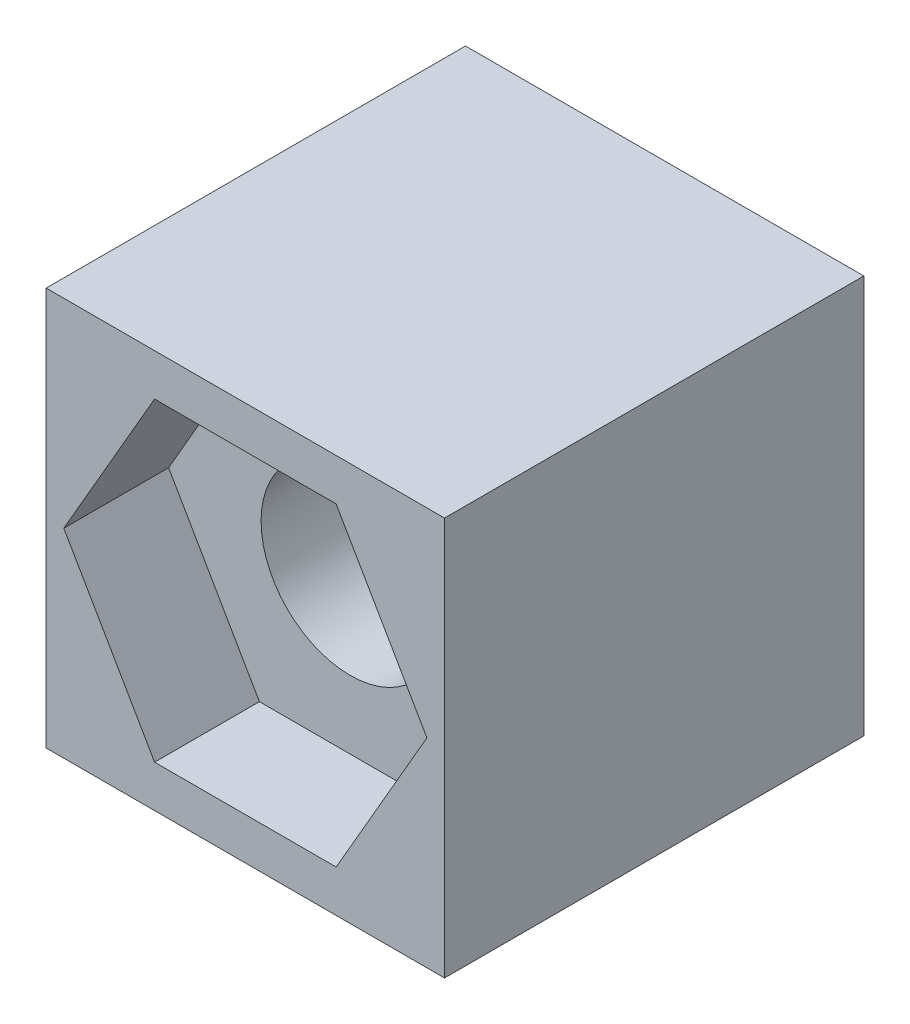
ISO-10303-21;
HEADER;
FILE_DESCRIPTION(('STEP AP214'),'2;1');
FILE_NAME('part.step','',(''),(''),'','','');
FILE_SCHEMA(('AUTOMOTIVE_DESIGN { 1 0 10303 214 1 1 1 1 }'));
ENDSEC;
DATA;
#1=APPLICATION_CONTEXT('core data for automotive mechanical design processes');
#2=APPLICATION_PROTOCOL_DEFINITION('international standard','automotive_design',2000,#1);
#3=PRODUCT_CONTEXT('',#1,'mechanical');
#4=PRODUCT('Part','Part','',(#3));
#5=PRODUCT_RELATED_PRODUCT_CATEGORY('part','',(#4));
#6=PRODUCT_DEFINITION_FORMATION('','',#4);
#7=PRODUCT_DEFINITION_CONTEXT('part definition',#1,'design');
#8=PRODUCT_DEFINITION('design','',#6,#7);
#9=PRODUCT_DEFINITION_SHAPE('','',#8);
#10=(LENGTH_UNIT() NAMED_UNIT(*) SI_UNIT(.MILLI.,.METRE.));
#11=(NAMED_UNIT(*) PLANE_ANGLE_UNIT() SI_UNIT($,.RADIAN.));
#12=(NAMED_UNIT(*) SI_UNIT($,.STERADIAN.) SOLID_ANGLE_UNIT());
#13=UNCERTAINTY_MEASURE_WITH_UNIT(LENGTH_MEASURE(1.E-05),#10,'distance_accuracy_value','');
#14=(GEOMETRIC_REPRESENTATION_CONTEXT(3) GLOBAL_UNCERTAINTY_ASSIGNED_CONTEXT((#13)) GLOBAL_UNIT_ASSIGNED_CONTEXT((#10,
#11,#12)) REPRESENTATION_CONTEXT('',''));
#15=CARTESIAN_POINT('',(0.,0.,0.));
#16=DIRECTION('',(0.,0.,1.));
#17=DIRECTION('',(1.,0.,0.));
#18=AXIS2_PLACEMENT_3D('',#15,#16,#17);
#19=CARTESIAN_POINT('',(3.8,3.8,8.));
#20=DIRECTION('',(0.,0.,-1.));
#21=DIRECTION('',(-1.,0.,0.));
#22=AXIS2_PLACEMENT_3D('',#19,#20,#21);
#23=CYLINDRICAL_SURFACE('',#22,1.7);
#24=CARTESIAN_POINT('',(3.8,3.8,0.));
#25=DIRECTION('',(0.,0.,1.));
#26=DIRECTION('',(1.,0.,0.));
#27=AXIS2_PLACEMENT_3D('',#24,#25,#26);
#28=CIRCLE('',#27,1.7);
#29=CARTESIAN_POINT('',(5.5,3.8,0.));
#30=VERTEX_POINT('',#29);
#31=EDGE_CURVE('E199',#30,#30,#28,.T.);
#32=ORIENTED_EDGE('',*,*,#31,.F.);
#33=EDGE_LOOP('',(#32));
#34=FACE_BOUND('',#33,.T.);
#35=CARTESIAN_POINT('',(3.8,3.8,6.));
#36=DIRECTION('',(0.,0.,1.));
#37=DIRECTION('',(1.,0.,0.));
#38=AXIS2_PLACEMENT_3D('',#35,#36,#37);
#39=CIRCLE('',#38,1.7);
#40=CARTESIAN_POINT('',(5.5,3.8,6.));
#41=VERTEX_POINT('',#40);
#42=EDGE_CURVE('E43',#41,#41,#39,.T.);
#43=ORIENTED_EDGE('',*,*,#42,.T.);
#44=EDGE_LOOP('',(#43));
#45=FACE_BOUND('',#44,.T.);
#46=ADVANCED_FACE('F39',(#34,#45),#23,.F.);
#47=CARTESIAN_POINT('',(0.,0.,8.));
#48=DIRECTION('',(0.,0.,-1.));
#49=DIRECTION('',(-1.,0.,0.));
#50=AXIS2_PLACEMENT_3D('',#47,#48,#49);
#51=PLANE('',#50);
#52=DIRECTION('',(0.5,0.866025403784439,0.));
#53=VECTOR('',#52,1.);
#54=CARTESIAN_POINT('',(5.53205080756888,0.800000000000002,8.));
#55=LINE('',#54,#53);
#56=CARTESIAN_POINT('',(5.53205080756888,0.800000000000002,8.));
#57=VERTEX_POINT('',#56);
#58=CARTESIAN_POINT('',(7.26410161513775,3.8,8.));
#59=VERTEX_POINT('',#58);
#60=EDGE_CURVE('E171',#57,#59,#55,.T.);
#61=ORIENTED_EDGE('',*,*,#60,.F.);
#62=DIRECTION('',(1.,0.,0.));
#63=VECTOR('',#62,1.);
#64=CARTESIAN_POINT('',(2.06794919243112,0.800000000000001,8.));
#65=LINE('',#64,#63);
#66=CARTESIAN_POINT('',(2.06794919243112,0.800000000000001,8.));
#67=VERTEX_POINT('',#66);
#68=EDGE_CURVE('E56',#67,#57,#65,.T.);
#69=ORIENTED_EDGE('',*,*,#68,.F.);
#70=DIRECTION('',(0.5,-0.866025403784439,0.));
#71=VECTOR('',#70,1.);
#72=CARTESIAN_POINT('',(0.335898384862246,3.8,8.));
#73=LINE('',#72,#71);
#74=CARTESIAN_POINT('',(0.335898384862246,3.8,8.));
#75=VERTEX_POINT('',#74);
#76=EDGE_CURVE('E151',#75,#67,#73,.T.);
#77=ORIENTED_EDGE('',*,*,#76,.F.);
#78=DIRECTION('',(-0.5,-0.866025403784438,0.));
#79=VECTOR('',#78,1.);
#80=CARTESIAN_POINT('',(2.06794919243112,6.8,8.));
#81=LINE('',#80,#79);
#82=CARTESIAN_POINT('',(2.06794919243112,6.8,8.));
#83=VERTEX_POINT('',#82);
#84=EDGE_CURVE('E155',#83,#75,#81,.T.);
#85=ORIENTED_EDGE('',*,*,#84,.F.);
#86=DIRECTION('',(-1.,0.,0.));
#87=VECTOR('',#86,1.);
#88=CARTESIAN_POINT('',(5.53205080756888,6.8,8.));
#89=LINE('',#88,#87);
#90=CARTESIAN_POINT('',(5.53205080756888,6.8,8.));
#91=VERTEX_POINT('',#90);
#92=EDGE_CURVE('E178',#91,#83,#89,.T.);
#93=ORIENTED_EDGE('',*,*,#92,.F.);
#94=DIRECTION('',(-0.5,0.866025403784439,0.));
#95=VECTOR('',#94,1.);
#96=CARTESIAN_POINT('',(7.26410161513775,3.8,8.));
#97=LINE('',#96,#95);
#98=EDGE_CURVE('E174',#59,#91,#97,.T.);
#99=ORIENTED_EDGE('',*,*,#98,.F.);
#100=EDGE_LOOP('',(#61,#69,#77,#85,#93,#99));
#101=FACE_BOUND('',#100,.T.);
#102=DIRECTION('',(0.,-1.,0.));
#103=VECTOR('',#102,1.);
#104=CARTESIAN_POINT('',(0.,0.,8.));
#105=LINE('',#104,#103);
#106=CARTESIAN_POINT('',(0.,7.6,8.));
#107=VERTEX_POINT('',#106);
#108=CARTESIAN_POINT('',(0.,0.,8.));
#109=VERTEX_POINT('',#108);
#110=EDGE_CURVE('E204',#107,#109,#105,.T.);
#111=ORIENTED_EDGE('',*,*,#110,.T.);
#112=DIRECTION('',(1.,0.,0.));
#113=VECTOR('',#112,1.);
#114=CARTESIAN_POINT('',(0.,0.,8.));
#115=LINE('',#114,#113);
#116=CARTESIAN_POINT('',(7.6,0.,8.));
#117=VERTEX_POINT('',#116);
#118=EDGE_CURVE('E93',#109,#117,#115,.T.);
#119=ORIENTED_EDGE('',*,*,#118,.T.);
#120=DIRECTION('',(0.,1.,0.));
#121=VECTOR('',#120,1.);
#122=CARTESIAN_POINT('',(7.6,0.,8.));
#123=LINE('',#122,#121);
#124=CARTESIAN_POINT('',(7.6,7.6,8.));
#125=VERTEX_POINT('',#124);
#126=EDGE_CURVE('E209',#117,#125,#123,.T.);
#127=ORIENTED_EDGE('',*,*,#126,.T.);
#128=DIRECTION('',(-1.,0.,0.));
#129=VECTOR('',#128,1.);
#130=CARTESIAN_POINT('',(0.,7.6,8.));
#131=LINE('',#130,#129);
#132=EDGE_CURVE('E65',#125,#107,#131,.T.);
#133=ORIENTED_EDGE('',*,*,#132,.T.);
#134=EDGE_LOOP('',(#111,#119,#127,#133));
#135=FACE_BOUND('',#134,.T.);
#136=ADVANCED_FACE('F258',(#101,#135),#51,.F.);
#137=CARTESIAN_POINT('',(0.,0.,0.));
#138=DIRECTION('',(0.,0.,-1.));
#139=DIRECTION('',(-1.,0.,0.));
#140=AXIS2_PLACEMENT_3D('',#137,#138,#139);
#141=PLANE('',#140);
#142=DIRECTION('',(0.,-1.,0.));
#143=VECTOR('',#142,1.);
#144=CARTESIAN_POINT('',(0.,0.,0.));
#145=LINE('',#144,#143);
#146=CARTESIAN_POINT('',(0.,7.6,0.));
#147=VERTEX_POINT('',#146);
#148=CARTESIAN_POINT('',(0.,0.,0.));
#149=VERTEX_POINT('',#148);
#150=EDGE_CURVE('E203',#147,#149,#145,.T.);
#151=ORIENTED_EDGE('',*,*,#150,.F.);
#152=DIRECTION('',(-1.,0.,0.));
#153=VECTOR('',#152,1.);
#154=CARTESIAN_POINT('',(0.,7.6,0.));
#155=LINE('',#154,#153);
#156=CARTESIAN_POINT('',(7.6,7.6,0.));
#157=VERTEX_POINT('',#156);
#158=EDGE_CURVE('E86',#157,#147,#155,.T.);
#159=ORIENTED_EDGE('',*,*,#158,.F.);
#160=DIRECTION('',(0.,1.,0.));
#161=VECTOR('',#160,1.);
#162=CARTESIAN_POINT('',(7.6,0.,0.));
#163=LINE('',#162,#161);
#164=CARTESIAN_POINT('',(7.6,0.,0.));
#165=VERTEX_POINT('',#164);
#166=EDGE_CURVE('E221',#165,#157,#163,.T.);
#167=ORIENTED_EDGE('',*,*,#166,.F.);
#168=DIRECTION('',(1.,0.,0.));
#169=VECTOR('',#168,1.);
#170=CARTESIAN_POINT('',(0.,0.,0.));
#171=LINE('',#170,#169);
#172=EDGE_CURVE('E218',#149,#165,#171,.T.);
#173=ORIENTED_EDGE('',*,*,#172,.F.);
#174=EDGE_LOOP('',(#151,#159,#167,#173));
#175=FACE_BOUND('',#174,.T.);
#176=ORIENTED_EDGE('',*,*,#31,.T.);
#177=EDGE_LOOP('',(#176));
#178=FACE_BOUND('',#177,.T.);
#179=ADVANCED_FACE('F240',(#175,#178),#141,.T.);
#180=CARTESIAN_POINT('',(0.,0.,8.));
#181=DIRECTION('',(1.,0.,0.));
#182=DIRECTION('',(0.,0.,-1.));
#183=AXIS2_PLACEMENT_3D('',#180,#181,#182);
#184=PLANE('',#183);
#185=ORIENTED_EDGE('',*,*,#150,.T.);
#186=DIRECTION('',(0.,0.,-1.));
#187=VECTOR('',#186,1.);
#188=CARTESIAN_POINT('',(0.,0.,8.));
#189=LINE('',#188,#187);
#190=EDGE_CURVE('E11',#109,#149,#189,.T.);
#191=ORIENTED_EDGE('',*,*,#190,.F.);
#192=ORIENTED_EDGE('',*,*,#110,.F.);
#193=DIRECTION('',(0.,0.,-1.));
#194=VECTOR('',#193,1.);
#195=CARTESIAN_POINT('',(0.,7.6,8.));
#196=LINE('',#195,#194);
#197=EDGE_CURVE('E214',#107,#147,#196,.T.);
#198=ORIENTED_EDGE('',*,*,#197,.T.);
#199=EDGE_LOOP('',(#185,#191,#192,#198));
#200=FACE_BOUND('',#199,.T.);
#201=ADVANCED_FACE('F41',(#200),#184,.F.);
#202=CARTESIAN_POINT('',(0.,0.,8.));
#203=DIRECTION('',(0.,1.,0.));
#204=DIRECTION('',(0.,0.,1.));
#205=AXIS2_PLACEMENT_3D('',#202,#203,#204);
#206=PLANE('',#205);
#207=ORIENTED_EDGE('',*,*,#172,.T.);
#208=DIRECTION('',(0.,0.,-1.));
#209=VECTOR('',#208,1.);
#210=CARTESIAN_POINT('',(7.6,0.,8.));
#211=LINE('',#210,#209);
#212=EDGE_CURVE('E49',#117,#165,#211,.T.);
#213=ORIENTED_EDGE('',*,*,#212,.F.);
#214=ORIENTED_EDGE('',*,*,#118,.F.);
#215=ORIENTED_EDGE('',*,*,#190,.T.);
#216=EDGE_LOOP('',(#207,#213,#214,#215));
#217=FACE_BOUND('',#216,.T.);
#218=ADVANCED_FACE('F254',(#217),#206,.F.);
#219=CARTESIAN_POINT('',(7.6,0.,8.));
#220=DIRECTION('',(-1.,0.,0.));
#221=DIRECTION('',(0.,0.,1.));
#222=AXIS2_PLACEMENT_3D('',#219,#220,#221);
#223=PLANE('',#222);
#224=ORIENTED_EDGE('',*,*,#166,.T.);
#225=DIRECTION('',(0.,0.,-1.));
#226=VECTOR('',#225,1.);
#227=CARTESIAN_POINT('',(7.6,7.6,8.));
#228=LINE('',#227,#226);
#229=EDGE_CURVE('E228',#125,#157,#228,.T.);
#230=ORIENTED_EDGE('',*,*,#229,.F.);
#231=ORIENTED_EDGE('',*,*,#126,.F.);
#232=ORIENTED_EDGE('',*,*,#212,.T.);
#233=EDGE_LOOP('',(#224,#230,#231,#232));
#234=FACE_BOUND('',#233,.T.);
#235=ADVANCED_FACE('F236',(#234),#223,.F.);
#236=CARTESIAN_POINT('',(0.,7.6,8.));
#237=DIRECTION('',(0.,-1.,0.));
#238=DIRECTION('',(0.,0.,-1.));
#239=AXIS2_PLACEMENT_3D('',#236,#237,#238);
#240=PLANE('',#239);
#241=ORIENTED_EDGE('',*,*,#158,.T.);
#242=ORIENTED_EDGE('',*,*,#197,.F.);
#243=ORIENTED_EDGE('',*,*,#132,.F.);
#244=ORIENTED_EDGE('',*,*,#229,.T.);
#245=EDGE_LOOP('',(#241,#242,#243,#244));
#246=FACE_BOUND('',#245,.T.);
#247=ADVANCED_FACE('F245',(#246),#240,.F.);
#248=CARTESIAN_POINT('',(2.06794919243112,0.800000000000001,6.));
#249=DIRECTION('',(0.,-1.,0.));
#250=DIRECTION('',(1.,0.,0.));
#251=AXIS2_PLACEMENT_3D('',#248,#249,#250);
#252=PLANE('',#251);
#253=ORIENTED_EDGE('',*,*,#68,.T.);
#254=DIRECTION('',(0.,0.,1.));
#255=VECTOR('',#254,1.);
#256=CARTESIAN_POINT('',(5.53205080756888,0.800000000000002,6.));
#257=LINE('',#256,#255);
#258=CARTESIAN_POINT('',(5.53205080756888,0.800000000000002,6.));
#259=VERTEX_POINT('',#258);
#260=EDGE_CURVE('E125',#259,#57,#257,.T.);
#261=ORIENTED_EDGE('',*,*,#260,.F.);
#262=DIRECTION('',(1.,0.,0.));
#263=VECTOR('',#262,1.);
#264=CARTESIAN_POINT('',(2.06794919243112,0.800000000000001,6.));
#265=LINE('',#264,#263);
#266=CARTESIAN_POINT('',(2.06794919243112,0.800000000000001,6.));
#267=VERTEX_POINT('',#266);
#268=EDGE_CURVE('E129',#267,#259,#265,.T.);
#269=ORIENTED_EDGE('',*,*,#268,.F.);
#270=DIRECTION('',(0.,0.,1.));
#271=VECTOR('',#270,1.);
#272=CARTESIAN_POINT('',(2.06794919243112,0.800000000000001,6.));
#273=LINE('',#272,#271);
#274=EDGE_CURVE('E185',#267,#67,#273,.T.);
#275=ORIENTED_EDGE('',*,*,#274,.T.);
#276=EDGE_LOOP('',(#253,#261,#269,#275));
#277=FACE_BOUND('',#276,.T.);
#278=ADVANCED_FACE('F127',(#277),#252,.F.);
#279=CARTESIAN_POINT('',(0.335898384862246,3.8,6.));
#280=DIRECTION('',(-0.866025403784439,-0.5,0.));
#281=DIRECTION('',(0.5,-0.866025403784439,0.));
#282=AXIS2_PLACEMENT_3D('',#279,#280,#281);
#283=PLANE('',#282);
#284=ORIENTED_EDGE('',*,*,#76,.T.);
#285=ORIENTED_EDGE('',*,*,#274,.F.);
#286=DIRECTION('',(0.5,-0.866025403784439,0.));
#287=VECTOR('',#286,1.);
#288=CARTESIAN_POINT('',(0.335898384862246,3.8,6.));
#289=LINE('',#288,#287);
#290=CARTESIAN_POINT('',(0.335898384862246,3.8,6.));
#291=VERTEX_POINT('',#290);
#292=EDGE_CURVE('E136',#291,#267,#289,.T.);
#293=ORIENTED_EDGE('',*,*,#292,.F.);
#294=DIRECTION('',(0.,0.,1.));
#295=VECTOR('',#294,1.);
#296=CARTESIAN_POINT('',(0.335898384862246,3.8,6.));
#297=LINE('',#296,#295);
#298=EDGE_CURVE('E188',#291,#75,#297,.T.);
#299=ORIENTED_EDGE('',*,*,#298,.T.);
#300=EDGE_LOOP('',(#284,#285,#293,#299));
#301=FACE_BOUND('',#300,.T.);
#302=ADVANCED_FACE('F252',(#301),#283,.F.);
#303=CARTESIAN_POINT('',(2.06794919243112,6.8,6.));
#304=DIRECTION('',(-0.866025403784438,0.5,0.));
#305=DIRECTION('',(-0.5,-0.866025403784438,0.));
#306=AXIS2_PLACEMENT_3D('',#303,#304,#305);
#307=PLANE('',#306);
#308=ORIENTED_EDGE('',*,*,#84,.T.);
#309=ORIENTED_EDGE('',*,*,#298,.F.);
#310=DIRECTION('',(-0.5,-0.866025403784438,0.));
#311=VECTOR('',#310,1.);
#312=CARTESIAN_POINT('',(2.06794919243112,6.8,6.));
#313=LINE('',#312,#311);
#314=CARTESIAN_POINT('',(2.06794919243112,6.8,6.));
#315=VERTEX_POINT('',#314);
#316=EDGE_CURVE('E164',#315,#291,#313,.T.);
#317=ORIENTED_EDGE('',*,*,#316,.F.);
#318=DIRECTION('',(0.,0.,1.));
#319=VECTOR('',#318,1.);
#320=CARTESIAN_POINT('',(2.06794919243112,6.8,6.));
#321=LINE('',#320,#319);
#322=EDGE_CURVE('E191',#315,#83,#321,.T.);
#323=ORIENTED_EDGE('',*,*,#322,.T.);
#324=EDGE_LOOP('',(#308,#309,#317,#323));
#325=FACE_BOUND('',#324,.T.);
#326=ADVANCED_FACE('F312',(#325),#307,.F.);
#327=CARTESIAN_POINT('',(5.53205080756888,6.8,6.));
#328=DIRECTION('',(0.,1.,0.));
#329=DIRECTION('',(0.,0.,1.));
#330=AXIS2_PLACEMENT_3D('',#327,#328,#329);
#331=PLANE('',#330);
#332=ORIENTED_EDGE('',*,*,#92,.T.);
#333=ORIENTED_EDGE('',*,*,#322,.F.);
#334=DIRECTION('',(-1.,0.,0.));
#335=VECTOR('',#334,1.);
#336=CARTESIAN_POINT('',(5.53205080756888,6.8,6.));
#337=LINE('',#336,#335);
#338=CARTESIAN_POINT('',(5.53205080756888,6.8,6.));
#339=VERTEX_POINT('',#338);
#340=EDGE_CURVE('E160',#339,#315,#337,.T.);
#341=ORIENTED_EDGE('',*,*,#340,.F.);
#342=DIRECTION('',(0.,0.,1.));
#343=VECTOR('',#342,1.);
#344=CARTESIAN_POINT('',(5.53205080756888,6.8,6.));
#345=LINE('',#344,#343);
#346=EDGE_CURVE('E194',#339,#91,#345,.T.);
#347=ORIENTED_EDGE('',*,*,#346,.T.);
#348=EDGE_LOOP('',(#332,#333,#341,#347));
#349=FACE_BOUND('',#348,.T.);
#350=ADVANCED_FACE('F322',(#349),#331,.F.);
#351=CARTESIAN_POINT('',(7.26410161513775,3.8,6.));
#352=DIRECTION('',(0.866025403784439,0.5,0.));
#353=DIRECTION('',(-0.5,0.866025403784439,0.));
#354=AXIS2_PLACEMENT_3D('',#351,#352,#353);
#355=PLANE('',#354);
#356=ORIENTED_EDGE('',*,*,#98,.T.);
#357=ORIENTED_EDGE('',*,*,#346,.F.);
#358=DIRECTION('',(-0.5,0.866025403784439,0.));
#359=VECTOR('',#358,1.);
#360=CARTESIAN_POINT('',(7.26410161513775,3.8,6.));
#361=LINE('',#360,#359);
#362=CARTESIAN_POINT('',(7.26410161513775,3.8,6.));
#363=VERTEX_POINT('',#362);
#364=EDGE_CURVE('E145',#363,#339,#361,.T.);
#365=ORIENTED_EDGE('',*,*,#364,.F.);
#366=DIRECTION('',(0.,0.,1.));
#367=VECTOR('',#366,1.);
#368=CARTESIAN_POINT('',(7.26410161513775,3.8,6.));
#369=LINE('',#368,#367);
#370=EDGE_CURVE('E135',#363,#59,#369,.T.);
#371=ORIENTED_EDGE('',*,*,#370,.T.);
#372=EDGE_LOOP('',(#356,#357,#365,#371));
#373=FACE_BOUND('',#372,.T.);
#374=ADVANCED_FACE('F332',(#373),#355,.F.);
#375=CARTESIAN_POINT('',(5.53205080756888,0.800000000000002,6.));
#376=DIRECTION('',(0.866025403784439,-0.5,0.));
#377=DIRECTION('',(0.5,0.866025403784439,0.));
#378=AXIS2_PLACEMENT_3D('',#375,#376,#377);
#379=PLANE('',#378);
#380=ORIENTED_EDGE('',*,*,#60,.T.);
#381=ORIENTED_EDGE('',*,*,#370,.F.);
#382=DIRECTION('',(0.5,0.866025403784439,0.));
#383=VECTOR('',#382,1.);
#384=CARTESIAN_POINT('',(5.53205080756888,0.800000000000002,6.));
#385=LINE('',#384,#383);
#386=EDGE_CURVE('E139',#259,#363,#385,.T.);
#387=ORIENTED_EDGE('',*,*,#386,.F.);
#388=ORIENTED_EDGE('',*,*,#260,.T.);
#389=EDGE_LOOP('',(#380,#381,#387,#388));
#390=FACE_BOUND('',#389,.T.);
#391=ADVANCED_FACE('F140',(#390),#379,.F.);
#392=CARTESIAN_POINT('',(0.,0.,6.));
#393=DIRECTION('',(0.,0.,1.));
#394=DIRECTION('',(1.,0.,0.));
#395=AXIS2_PLACEMENT_3D('',#392,#393,#394);
#396=PLANE('',#395);
#397=ORIENTED_EDGE('',*,*,#42,.F.);
#398=EDGE_LOOP('',(#397));
#399=FACE_BOUND('',#398,.T.);
#400=ORIENTED_EDGE('',*,*,#268,.T.);
#401=ORIENTED_EDGE('',*,*,#386,.T.);
#402=ORIENTED_EDGE('',*,*,#364,.T.);
#403=ORIENTED_EDGE('',*,*,#340,.T.);
#404=ORIENTED_EDGE('',*,*,#316,.T.);
#405=ORIENTED_EDGE('',*,*,#292,.T.);
#406=EDGE_LOOP('',(#400,#401,#402,#403,#404,#405));
#407=FACE_BOUND('',#406,.T.);
#408=ADVANCED_FACE('F147',(#399,#407),#396,.T.);
#409=CLOSED_SHELL('',(#46,#136,#179,#201,#218,#235,#247,#278,#302,#326,#350,#374,#391,#408));
#410=MANIFOLD_SOLID_BREP('B2',#409);
#411=ADVANCED_BREP_SHAPE_REPRESENTATION('',(#18,#410),#14);
#412=SHAPE_DEFINITION_REPRESENTATION(#9,#411);
ENDSEC;
END-ISO-10303-21;
